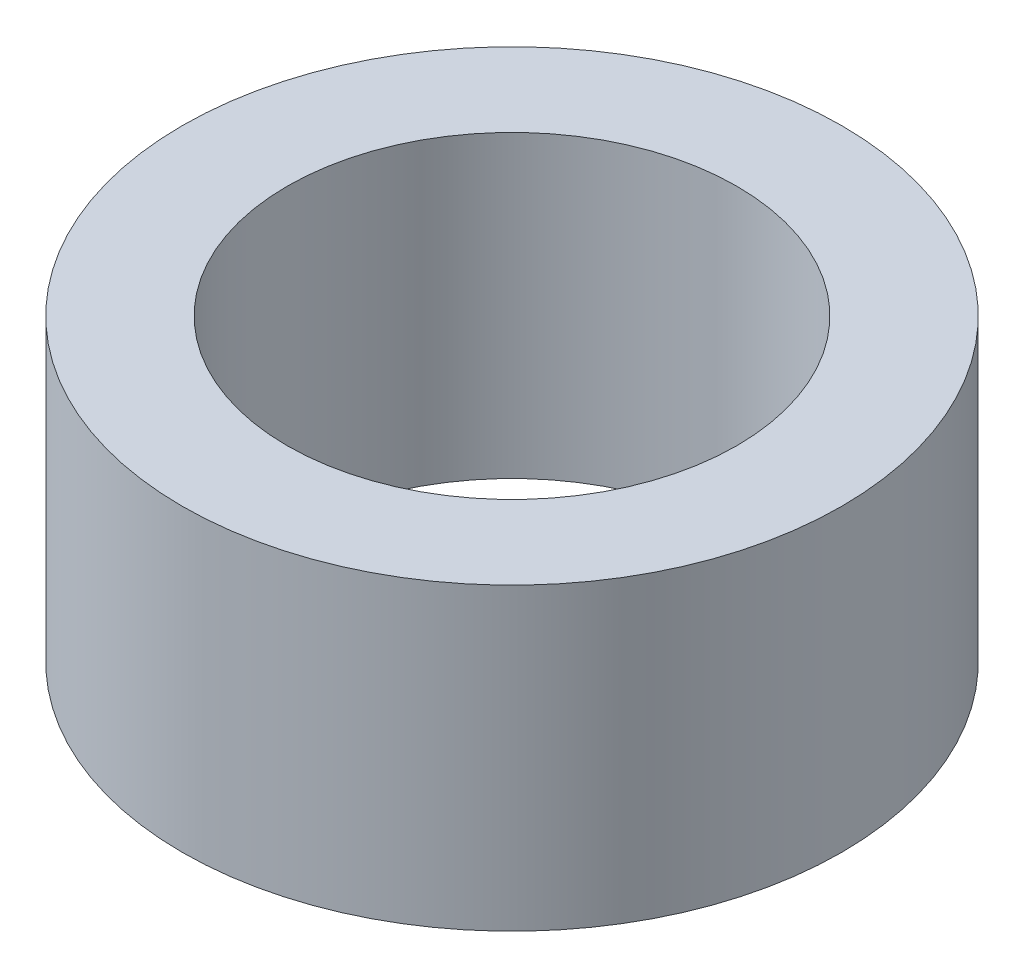
ISO-10303-21;
HEADER;
FILE_DESCRIPTION(('STEP AP214'),'2;1');
FILE_NAME('part.step','',(''),(''),'','','');
FILE_SCHEMA(('AUTOMOTIVE_DESIGN { 1 0 10303 214 1 1 1 1 }'));
ENDSEC;
DATA;
#1=APPLICATION_CONTEXT('core data for automotive mechanical design processes');
#2=APPLICATION_PROTOCOL_DEFINITION('international standard','automotive_design',2000,#1);
#3=PRODUCT_CONTEXT('',#1,'mechanical');
#4=PRODUCT('Part','Part','',(#3));
#5=PRODUCT_RELATED_PRODUCT_CATEGORY('part','',(#4));
#6=PRODUCT_DEFINITION_FORMATION('','',#4);
#7=PRODUCT_DEFINITION_CONTEXT('part definition',#1,'design');
#8=PRODUCT_DEFINITION('design','',#6,#7);
#9=PRODUCT_DEFINITION_SHAPE('','',#8);
#10=(LENGTH_UNIT() NAMED_UNIT(*) SI_UNIT(.MILLI.,.METRE.));
#11=(NAMED_UNIT(*) PLANE_ANGLE_UNIT() SI_UNIT($,.RADIAN.));
#12=(NAMED_UNIT(*) SI_UNIT($,.STERADIAN.) SOLID_ANGLE_UNIT());
#13=UNCERTAINTY_MEASURE_WITH_UNIT(LENGTH_MEASURE(1.E-05),#10,'distance_accuracy_value','');
#14=(GEOMETRIC_REPRESENTATION_CONTEXT(3) GLOBAL_UNCERTAINTY_ASSIGNED_CONTEXT((#13)) GLOBAL_UNIT_ASSIGNED_CONTEXT((#10,
#11,#12)) REPRESENTATION_CONTEXT('',''));
#15=CARTESIAN_POINT('',(0.,0.,0.));
#16=DIRECTION('',(0.,0.,1.));
#17=DIRECTION('',(1.,0.,0.));
#18=AXIS2_PLACEMENT_3D('',#15,#16,#17);
#19=CARTESIAN_POINT('',(0.,10.,0.));
#20=DIRECTION('',(0.,-1.,0.));
#21=DIRECTION('',(0.,0.,-1.));
#22=AXIS2_PLACEMENT_3D('',#19,#20,#21);
#23=CYLINDRICAL_SURFACE('',#22,11.);
#24=CARTESIAN_POINT('',(0.,10.,0.));
#25=DIRECTION('',(0.,1.,0.));
#26=DIRECTION('',(0.,0.,1.));
#27=AXIS2_PLACEMENT_3D('',#24,#25,#26);
#28=CIRCLE('',#27,11.);
#29=CARTESIAN_POINT('',(0.,10.,11.));
#30=VERTEX_POINT('',#29);
#31=EDGE_CURVE('E10',#30,#30,#28,.T.);
#32=ORIENTED_EDGE('',*,*,#31,.F.);
#33=EDGE_LOOP('',(#32));
#34=FACE_BOUND('',#33,.T.);
#35=CARTESIAN_POINT('',(0.,0.,0.));
#36=DIRECTION('',(0.,1.,0.));
#37=DIRECTION('',(0.,0.,1.));
#38=AXIS2_PLACEMENT_3D('',#35,#36,#37);
#39=CIRCLE('',#38,11.);
#40=CARTESIAN_POINT('',(0.,0.,11.));
#41=VERTEX_POINT('',#40);
#42=EDGE_CURVE('E33',#41,#41,#39,.T.);
#43=ORIENTED_EDGE('',*,*,#42,.T.);
#44=EDGE_LOOP('',(#43));
#45=FACE_BOUND('',#44,.T.);
#46=ADVANCED_FACE('F30',(#34,#45),#23,.T.);
#47=CARTESIAN_POINT('',(0.,10.,0.));
#48=DIRECTION('',(0.,1.,0.));
#49=DIRECTION('',(0.,0.,1.));
#50=AXIS2_PLACEMENT_3D('',#47,#48,#49);
#51=PLANE('',#50);
#52=CARTESIAN_POINT('',(0.,10.,0.));
#53=DIRECTION('',(0.,1.,0.));
#54=DIRECTION('',(0.,0.,1.));
#55=AXIS2_PLACEMENT_3D('',#52,#53,#54);
#56=CIRCLE('',#55,7.5);
#57=CARTESIAN_POINT('',(0.,10.,7.5));
#58=VERTEX_POINT('',#57);
#59=EDGE_CURVE('E42',#58,#58,#56,.T.);
#60=ORIENTED_EDGE('',*,*,#59,.F.);
#61=EDGE_LOOP('',(#60));
#62=FACE_BOUND('',#61,.T.);
#63=ORIENTED_EDGE('',*,*,#31,.T.);
#64=EDGE_LOOP('',(#63));
#65=FACE_BOUND('',#64,.T.);
#66=ADVANCED_FACE('F57',(#62,#65),#51,.T.);
#67=CARTESIAN_POINT('',(0.,0.,0.));
#68=DIRECTION('',(0.,1.,0.));
#69=DIRECTION('',(0.,0.,1.));
#70=AXIS2_PLACEMENT_3D('',#67,#68,#69);
#71=PLANE('',#70);
#72=CARTESIAN_POINT('',(0.,0.,0.));
#73=DIRECTION('',(0.,1.,0.));
#74=DIRECTION('',(0.,0.,1.));
#75=AXIS2_PLACEMENT_3D('',#72,#73,#74);
#76=CIRCLE('',#75,7.5);
#77=CARTESIAN_POINT('',(0.,0.,7.5));
#78=VERTEX_POINT('',#77);
#79=EDGE_CURVE('E40',#78,#78,#76,.T.);
#80=ORIENTED_EDGE('',*,*,#79,.T.);
#81=EDGE_LOOP('',(#80));
#82=FACE_BOUND('',#81,.T.);
#83=ORIENTED_EDGE('',*,*,#42,.F.);
#84=EDGE_LOOP('',(#83));
#85=FACE_BOUND('',#84,.T.);
#86=ADVANCED_FACE('F48',(#82,#85),#71,.F.);
#87=CARTESIAN_POINT('',(0.,0.,0.));
#88=DIRECTION('',(0.,1.,0.));
#89=DIRECTION('',(0.,0.,1.));
#90=AXIS2_PLACEMENT_3D('',#87,#88,#89);
#91=CYLINDRICAL_SURFACE('',#90,7.5);
#92=ORIENTED_EDGE('',*,*,#79,.F.);
#93=EDGE_LOOP('',(#92));
#94=FACE_BOUND('',#93,.T.);
#95=ORIENTED_EDGE('',*,*,#59,.T.);
#96=EDGE_LOOP('',(#95));
#97=FACE_BOUND('',#96,.T.);
#98=ADVANCED_FACE('F51',(#94,#97),#91,.F.);
#99=CLOSED_SHELL('',(#46,#66,#86,#98));
#100=MANIFOLD_SOLID_BREP('B2',#99);
#101=ADVANCED_BREP_SHAPE_REPRESENTATION('',(#18,#100),#14);
#102=SHAPE_DEFINITION_REPRESENTATION(#9,#101);
ENDSEC;
END-ISO-10303-21;
